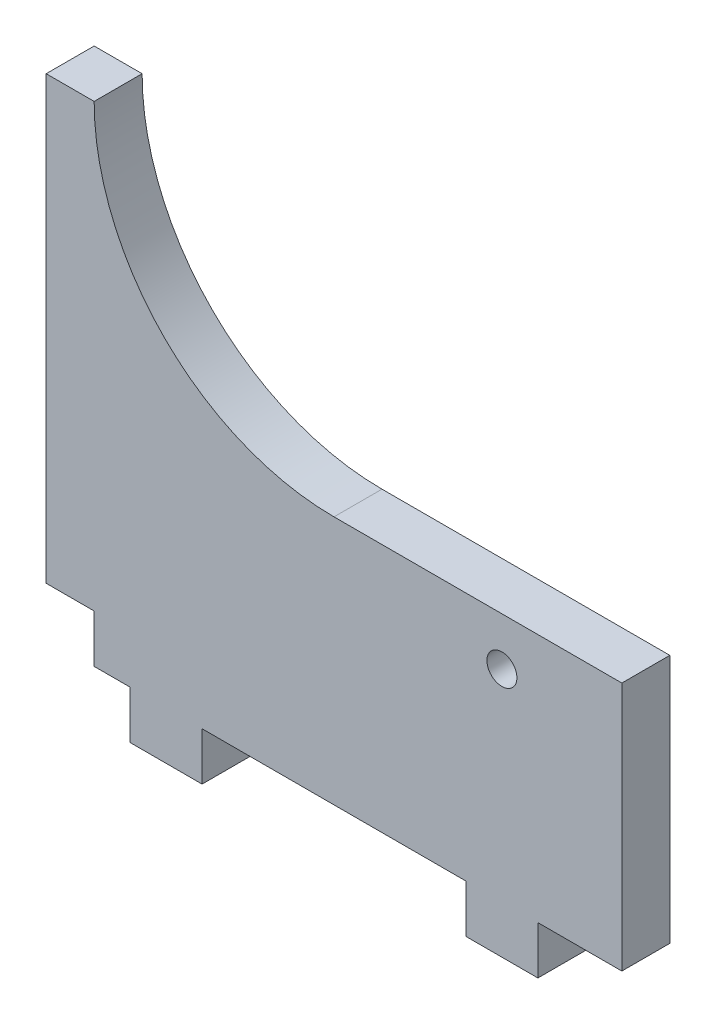
ISO-10303-21;
HEADER;
FILE_DESCRIPTION(('STEP AP214'),'2;1');
FILE_NAME('part.step','',(''),(''),'','','');
FILE_SCHEMA(('AUTOMOTIVE_DESIGN { 1 0 10303 214 1 1 1 1 }'));
ENDSEC;
DATA;
#1=APPLICATION_CONTEXT('core data for automotive mechanical design processes');
#2=APPLICATION_PROTOCOL_DEFINITION('international standard','automotive_design',2000,#1);
#3=PRODUCT_CONTEXT('',#1,'mechanical');
#4=PRODUCT('Part','Part','',(#3));
#5=PRODUCT_RELATED_PRODUCT_CATEGORY('part','',(#4));
#6=PRODUCT_DEFINITION_FORMATION('','',#4);
#7=PRODUCT_DEFINITION_CONTEXT('part definition',#1,'design');
#8=PRODUCT_DEFINITION('design','',#6,#7);
#9=PRODUCT_DEFINITION_SHAPE('','',#8);
#10=(LENGTH_UNIT() NAMED_UNIT(*) SI_UNIT(.MILLI.,.METRE.));
#11=(NAMED_UNIT(*) PLANE_ANGLE_UNIT() SI_UNIT($,.RADIAN.));
#12=(NAMED_UNIT(*) SI_UNIT($,.STERADIAN.) SOLID_ANGLE_UNIT());
#13=UNCERTAINTY_MEASURE_WITH_UNIT(LENGTH_MEASURE(1.E-05),#10,'distance_accuracy_value','');
#14=(GEOMETRIC_REPRESENTATION_CONTEXT(3) GLOBAL_UNCERTAINTY_ASSIGNED_CONTEXT((#13)) GLOBAL_UNIT_ASSIGNED_CONTEXT((#10,
#11,#12)) REPRESENTATION_CONTEXT('',''));
#15=CARTESIAN_POINT('',(0.,0.,0.));
#16=DIRECTION('',(0.,0.,1.));
#17=DIRECTION('',(1.,0.,0.));
#18=AXIS2_PLACEMENT_3D('',#15,#16,#17);
#19=CARTESIAN_POINT('',(0.,142.24,12.7));
#20=DIRECTION('',(0.,0.,-1.));
#21=DIRECTION('',(-1.,0.,0.));
#22=AXIS2_PLACEMENT_3D('',#19,#20,#21);
#23=CYLINDRICAL_SURFACE('',#22,63.5);
#24=DIRECTION('',(0.,0.,1.));
#25=VECTOR('',#24,1.);
#26=CARTESIAN_POINT('',(0.,78.74,0.));
#27=LINE('',#26,#25);
#28=CARTESIAN_POINT('',(0.,78.74,0.));
#29=VERTEX_POINT('',#28);
#30=CARTESIAN_POINT('',(0.,78.74,12.7));
#31=VERTEX_POINT('',#30);
#32=EDGE_CURVE('E144',#29,#31,#27,.T.);
#33=ORIENTED_EDGE('',*,*,#32,.F.);
#34=CARTESIAN_POINT('',(0.,142.24,0.));
#35=DIRECTION('',(0.,0.,-1.));
#36=DIRECTION('',(1.,0.,0.));
#37=AXIS2_PLACEMENT_3D('',#34,#35,#36);
#38=CIRCLE('',#37,63.5);
#39=CARTESIAN_POINT('',(-63.5,142.24,0.));
#40=VERTEX_POINT('',#39);
#41=EDGE_CURVE('E155',#29,#40,#38,.T.);
#42=ORIENTED_EDGE('',*,*,#41,.T.);
#43=DIRECTION('',(0.,0.,-1.));
#44=VECTOR('',#43,1.);
#45=CARTESIAN_POINT('',(-63.5,142.24,12.7));
#46=LINE('',#45,#44);
#47=CARTESIAN_POINT('',(-63.5,142.24,12.7));
#48=VERTEX_POINT('',#47);
#49=EDGE_CURVE('E174',#48,#40,#46,.T.);
#50=ORIENTED_EDGE('',*,*,#49,.F.);
#51=CARTESIAN_POINT('',(0.,142.24,12.7));
#52=DIRECTION('',(0.,0.,-1.));
#53=DIRECTION('',(1.,0.,0.));
#54=AXIS2_PLACEMENT_3D('',#51,#52,#53);
#55=CIRCLE('',#54,63.5);
#56=EDGE_CURVE('E157',#31,#48,#55,.T.);
#57=ORIENTED_EDGE('',*,*,#56,.F.);
#58=EDGE_LOOP('',(#33,#42,#50,#57));
#59=FACE_BOUND('',#58,.T.);
#60=ADVANCED_FACE('F31',(#59),#23,.F.);
#61=CARTESIAN_POINT('',(-76.2,12.7,12.7));
#62=DIRECTION('',(1.,0.,0.));
#63=DIRECTION('',(0.,1.,0.));
#64=AXIS2_PLACEMENT_3D('',#61,#62,#63);
#65=PLANE('',#64);
#66=DIRECTION('',(0.,-1.,0.));
#67=VECTOR('',#66,1.);
#68=CARTESIAN_POINT('',(-76.2,12.7,0.));
#69=LINE('',#68,#67);
#70=CARTESIAN_POINT('',(-76.2,142.24,0.));
#71=VERTEX_POINT('',#70);
#72=CARTESIAN_POINT('',(-76.2,25.4,0.));
#73=VERTEX_POINT('',#72);
#74=EDGE_CURVE('E248',#71,#73,#69,.T.);
#75=ORIENTED_EDGE('',*,*,#74,.T.);
#76=DIRECTION('',(0.,0.,1.));
#77=VECTOR('',#76,1.);
#78=CARTESIAN_POINT('',(-76.2,25.4,0.));
#79=LINE('',#78,#77);
#80=CARTESIAN_POINT('',(-76.2,25.4,12.7));
#81=VERTEX_POINT('',#80);
#82=EDGE_CURVE('E427',#73,#81,#79,.T.);
#83=ORIENTED_EDGE('',*,*,#82,.T.);
#84=DIRECTION('',(0.,-1.,0.));
#85=VECTOR('',#84,1.);
#86=CARTESIAN_POINT('',(-76.2,12.7,12.7));
#87=LINE('',#86,#85);
#88=CARTESIAN_POINT('',(-76.2,142.24,12.7));
#89=VERTEX_POINT('',#88);
#90=EDGE_CURVE('E165',#89,#81,#87,.T.);
#91=ORIENTED_EDGE('',*,*,#90,.F.);
#92=DIRECTION('',(0.,0.,-1.));
#93=VECTOR('',#92,1.);
#94=CARTESIAN_POINT('',(-76.2,142.24,12.7));
#95=LINE('',#94,#93);
#96=EDGE_CURVE('E171',#89,#71,#95,.T.);
#97=ORIENTED_EDGE('',*,*,#96,.T.);
#98=EDGE_LOOP('',(#75,#83,#91,#97));
#99=FACE_BOUND('',#98,.T.);
#100=ADVANCED_FACE('F33',(#99),#65,.F.);
#101=CARTESIAN_POINT('',(-76.2,12.7,12.7));
#102=DIRECTION('',(0.,1.,0.));
#103=DIRECTION('',(0.,0.,1.));
#104=AXIS2_PLACEMENT_3D('',#101,#102,#103);
#105=PLANE('',#104);
#106=DIRECTION('',(1.,0.,0.));
#107=VECTOR('',#106,1.);
#108=CARTESIAN_POINT('',(-76.2,12.7,12.7));
#109=LINE('',#108,#107);
#110=CARTESIAN_POINT('',(-63.5,12.7,12.7));
#111=VERTEX_POINT('',#110);
#112=CARTESIAN_POINT('',(-53.975,12.7,12.7));
#113=VERTEX_POINT('',#112);
#114=EDGE_CURVE('E260',#111,#113,#109,.T.);
#115=ORIENTED_EDGE('',*,*,#114,.F.);
#116=DIRECTION('',(0.,0.,1.));
#117=VECTOR('',#116,1.);
#118=CARTESIAN_POINT('',(-63.5,12.7,0.));
#119=LINE('',#118,#117);
#120=CARTESIAN_POINT('',(-63.5,12.7,0.));
#121=VERTEX_POINT('',#120);
#122=EDGE_CURVE('E256',#121,#111,#119,.T.);
#123=ORIENTED_EDGE('',*,*,#122,.F.);
#124=DIRECTION('',(1.,0.,0.));
#125=VECTOR('',#124,1.);
#126=CARTESIAN_POINT('',(-76.2,12.7,0.));
#127=LINE('',#126,#125);
#128=CARTESIAN_POINT('',(-53.975,12.7,0.));
#129=VERTEX_POINT('',#128);
#130=EDGE_CURVE('E217',#121,#129,#127,.T.);
#131=ORIENTED_EDGE('',*,*,#130,.T.);
#132=DIRECTION('',(0.,0.,-1.));
#133=VECTOR('',#132,1.);
#134=CARTESIAN_POINT('',(-53.975,12.7,12.7));
#135=LINE('',#134,#133);
#136=EDGE_CURVE('E11',#113,#129,#135,.T.);
#137=ORIENTED_EDGE('',*,*,#136,.F.);
#138=EDGE_LOOP('',(#115,#123,#131,#137));
#139=FACE_BOUND('',#138,.T.);
#140=ADVANCED_FACE('F255',(#139),#105,.F.);
#141=CARTESIAN_POINT('',(-53.975,0.,12.7));
#142=DIRECTION('',(1.,0.,0.));
#143=DIRECTION('',(0.,0.,-1.));
#144=AXIS2_PLACEMENT_3D('',#141,#142,#143);
#145=PLANE('',#144);
#146=DIRECTION('',(0.,-1.,0.));
#147=VECTOR('',#146,1.);
#148=CARTESIAN_POINT('',(-53.975,0.,0.));
#149=LINE('',#148,#147);
#150=CARTESIAN_POINT('',(-53.975,0.,0.));
#151=VERTEX_POINT('',#150);
#152=EDGE_CURVE('E211',#129,#151,#149,.T.);
#153=ORIENTED_EDGE('',*,*,#152,.T.);
#154=DIRECTION('',(0.,0.,-1.));
#155=VECTOR('',#154,1.);
#156=CARTESIAN_POINT('',(-53.975,0.,12.7));
#157=LINE('',#156,#155);
#158=CARTESIAN_POINT('',(-53.975,0.,12.7));
#159=VERTEX_POINT('',#158);
#160=EDGE_CURVE('E39',#159,#151,#157,.T.);
#161=ORIENTED_EDGE('',*,*,#160,.F.);
#162=DIRECTION('',(0.,-1.,0.));
#163=VECTOR('',#162,1.);
#164=CARTESIAN_POINT('',(-53.975,0.,12.7));
#165=LINE('',#164,#163);
#166=EDGE_CURVE('E259',#113,#159,#165,.T.);
#167=ORIENTED_EDGE('',*,*,#166,.F.);
#168=ORIENTED_EDGE('',*,*,#136,.T.);
#169=EDGE_LOOP('',(#153,#161,#167,#168));
#170=FACE_BOUND('',#169,.T.);
#171=ADVANCED_FACE('F258',(#170),#145,.F.);
#172=CARTESIAN_POINT('',(-53.975,0.,12.7));
#173=DIRECTION('',(0.,1.,0.));
#174=DIRECTION('',(0.,0.,1.));
#175=AXIS2_PLACEMENT_3D('',#172,#173,#174);
#176=PLANE('',#175);
#177=DIRECTION('',(1.,0.,0.));
#178=VECTOR('',#177,1.);
#179=CARTESIAN_POINT('',(-53.975,0.,0.));
#180=LINE('',#179,#178);
#181=CARTESIAN_POINT('',(-34.925,0.,0.));
#182=VERTEX_POINT('',#181);
#183=EDGE_CURVE('E204',#151,#182,#180,.T.);
#184=ORIENTED_EDGE('',*,*,#183,.T.);
#185=DIRECTION('',(0.,0.,-1.));
#186=VECTOR('',#185,1.);
#187=CARTESIAN_POINT('',(-34.925,0.,12.7));
#188=LINE('',#187,#186);
#189=CARTESIAN_POINT('',(-34.925,0.,12.7));
#190=VERTEX_POINT('',#189);
#191=EDGE_CURVE('E195',#190,#182,#188,.T.);
#192=ORIENTED_EDGE('',*,*,#191,.F.);
#193=DIRECTION('',(1.,0.,0.));
#194=VECTOR('',#193,1.);
#195=CARTESIAN_POINT('',(-53.975,0.,12.7));
#196=LINE('',#195,#194);
#197=EDGE_CURVE('E205',#159,#190,#196,.T.);
#198=ORIENTED_EDGE('',*,*,#197,.F.);
#199=ORIENTED_EDGE('',*,*,#160,.T.);
#200=EDGE_LOOP('',(#184,#192,#198,#199));
#201=FACE_BOUND('',#200,.T.);
#202=ADVANCED_FACE('F202',(#201),#176,.F.);
#203=CARTESIAN_POINT('',(-34.925,0.,12.7));
#204=DIRECTION('',(-1.,0.,0.));
#205=DIRECTION('',(0.,0.,1.));
#206=AXIS2_PLACEMENT_3D('',#203,#204,#205);
#207=PLANE('',#206);
#208=DIRECTION('',(0.,1.,0.));
#209=VECTOR('',#208,1.);
#210=CARTESIAN_POINT('',(-34.925,0.,0.));
#211=LINE('',#210,#209);
#212=CARTESIAN_POINT('',(-34.925,12.7,0.));
#213=VERTEX_POINT('',#212);
#214=EDGE_CURVE('E213',#182,#213,#211,.T.);
#215=ORIENTED_EDGE('',*,*,#214,.T.);
#216=DIRECTION('',(0.,0.,-1.));
#217=VECTOR('',#216,1.);
#218=CARTESIAN_POINT('',(-34.925,12.7,12.7));
#219=LINE('',#218,#217);
#220=CARTESIAN_POINT('',(-34.925,12.7,12.7));
#221=VERTEX_POINT('',#220);
#222=EDGE_CURVE('E192',#221,#213,#219,.T.);
#223=ORIENTED_EDGE('',*,*,#222,.F.);
#224=DIRECTION('',(0.,1.,0.));
#225=VECTOR('',#224,1.);
#226=CARTESIAN_POINT('',(-34.925,0.,12.7));
#227=LINE('',#226,#225);
#228=EDGE_CURVE('E262',#190,#221,#227,.T.);
#229=ORIENTED_EDGE('',*,*,#228,.F.);
#230=ORIENTED_EDGE('',*,*,#191,.T.);
#231=EDGE_LOOP('',(#215,#223,#229,#230));
#232=FACE_BOUND('',#231,.T.);
#233=ADVANCED_FACE('F295',(#232),#207,.F.);
#234=CARTESIAN_POINT('',(-34.925,12.7,12.7));
#235=DIRECTION('',(0.,1.,0.));
#236=DIRECTION('',(0.,0.,1.));
#237=AXIS2_PLACEMENT_3D('',#234,#235,#236);
#238=PLANE('',#237);
#239=DIRECTION('',(1.,0.,0.));
#240=VECTOR('',#239,1.);
#241=CARTESIAN_POINT('',(-34.925,12.7,0.));
#242=LINE('',#241,#240);
#243=CARTESIAN_POINT('',(34.925,12.7,0.));
#244=VERTEX_POINT('',#243);
#245=EDGE_CURVE('E215',#213,#244,#242,.T.);
#246=ORIENTED_EDGE('',*,*,#245,.T.);
#247=DIRECTION('',(0.,0.,-1.));
#248=VECTOR('',#247,1.);
#249=CARTESIAN_POINT('',(34.925,12.7,12.7));
#250=LINE('',#249,#248);
#251=CARTESIAN_POINT('',(34.925,12.7,12.7));
#252=VERTEX_POINT('',#251);
#253=EDGE_CURVE('E189',#252,#244,#250,.T.);
#254=ORIENTED_EDGE('',*,*,#253,.F.);
#255=DIRECTION('',(1.,0.,0.));
#256=VECTOR('',#255,1.);
#257=CARTESIAN_POINT('',(-34.925,12.7,12.7));
#258=LINE('',#257,#256);
#259=EDGE_CURVE('E268',#221,#252,#258,.T.);
#260=ORIENTED_EDGE('',*,*,#259,.F.);
#261=ORIENTED_EDGE('',*,*,#222,.T.);
#262=EDGE_LOOP('',(#246,#254,#260,#261));
#263=FACE_BOUND('',#262,.T.);
#264=ADVANCED_FACE('F291',(#263),#238,.F.);
#265=CARTESIAN_POINT('',(34.925,0.,12.7));
#266=DIRECTION('',(1.,0.,0.));
#267=DIRECTION('',(0.,0.,-1.));
#268=AXIS2_PLACEMENT_3D('',#265,#266,#267);
#269=PLANE('',#268);
#270=DIRECTION('',(0.,-1.,0.));
#271=VECTOR('',#270,1.);
#272=CARTESIAN_POINT('',(34.925,0.,0.));
#273=LINE('',#272,#271);
#274=CARTESIAN_POINT('',(34.925,0.,0.));
#275=VERTEX_POINT('',#274);
#276=EDGE_CURVE('E222',#244,#275,#273,.T.);
#277=ORIENTED_EDGE('',*,*,#276,.T.);
#278=DIRECTION('',(0.,0.,-1.));
#279=VECTOR('',#278,1.);
#280=CARTESIAN_POINT('',(34.925,0.,12.7));
#281=LINE('',#280,#279);
#282=CARTESIAN_POINT('',(34.925,0.,12.7));
#283=VERTEX_POINT('',#282);
#284=EDGE_CURVE('E186',#283,#275,#281,.T.);
#285=ORIENTED_EDGE('',*,*,#284,.F.);
#286=DIRECTION('',(0.,-1.,0.));
#287=VECTOR('',#286,1.);
#288=CARTESIAN_POINT('',(34.925,0.,12.7));
#289=LINE('',#288,#287);
#290=EDGE_CURVE('E270',#252,#283,#289,.T.);
#291=ORIENTED_EDGE('',*,*,#290,.F.);
#292=ORIENTED_EDGE('',*,*,#253,.T.);
#293=EDGE_LOOP('',(#277,#285,#291,#292));
#294=FACE_BOUND('',#293,.T.);
#295=ADVANCED_FACE('F287',(#294),#269,.F.);
#296=CARTESIAN_POINT('',(34.925,0.,12.7));
#297=DIRECTION('',(0.,1.,0.));
#298=DIRECTION('',(0.,0.,1.));
#299=AXIS2_PLACEMENT_3D('',#296,#297,#298);
#300=PLANE('',#299);
#301=DIRECTION('',(1.,0.,0.));
#302=VECTOR('',#301,1.);
#303=CARTESIAN_POINT('',(34.925,0.,0.));
#304=LINE('',#303,#302);
#305=CARTESIAN_POINT('',(53.975,0.,0.));
#306=VERTEX_POINT('',#305);
#307=EDGE_CURVE('E224',#275,#306,#304,.T.);
#308=ORIENTED_EDGE('',*,*,#307,.T.);
#309=DIRECTION('',(0.,0.,-1.));
#310=VECTOR('',#309,1.);
#311=CARTESIAN_POINT('',(53.975,0.,12.7));
#312=LINE('',#311,#310);
#313=CARTESIAN_POINT('',(53.975,0.,12.7));
#314=VERTEX_POINT('',#313);
#315=EDGE_CURVE('E183',#314,#306,#312,.T.);
#316=ORIENTED_EDGE('',*,*,#315,.F.);
#317=DIRECTION('',(1.,0.,0.));
#318=VECTOR('',#317,1.);
#319=CARTESIAN_POINT('',(34.925,0.,12.7));
#320=LINE('',#319,#318);
#321=EDGE_CURVE('E272',#283,#314,#320,.T.);
#322=ORIENTED_EDGE('',*,*,#321,.F.);
#323=ORIENTED_EDGE('',*,*,#284,.T.);
#324=EDGE_LOOP('',(#308,#316,#322,#323));
#325=FACE_BOUND('',#324,.T.);
#326=ADVANCED_FACE('F283',(#325),#300,.F.);
#327=CARTESIAN_POINT('',(53.975,0.,12.7));
#328=DIRECTION('',(-1.,0.,0.));
#329=DIRECTION('',(0.,0.,1.));
#330=AXIS2_PLACEMENT_3D('',#327,#328,#329);
#331=PLANE('',#330);
#332=DIRECTION('',(0.,1.,0.));
#333=VECTOR('',#332,1.);
#334=CARTESIAN_POINT('',(53.975,0.,0.));
#335=LINE('',#334,#333);
#336=CARTESIAN_POINT('',(53.975,12.7,0.));
#337=VERTEX_POINT('',#336);
#338=EDGE_CURVE('E226',#306,#337,#335,.T.);
#339=ORIENTED_EDGE('',*,*,#338,.T.);
#340=DIRECTION('',(0.,0.,-1.));
#341=VECTOR('',#340,1.);
#342=CARTESIAN_POINT('',(53.975,12.7,12.7));
#343=LINE('',#342,#341);
#344=CARTESIAN_POINT('',(53.975,12.7,12.7));
#345=VERTEX_POINT('',#344);
#346=EDGE_CURVE('E180',#345,#337,#343,.T.);
#347=ORIENTED_EDGE('',*,*,#346,.F.);
#348=DIRECTION('',(0.,1.,0.));
#349=VECTOR('',#348,1.);
#350=CARTESIAN_POINT('',(53.975,0.,12.7));
#351=LINE('',#350,#349);
#352=EDGE_CURVE('E243',#314,#345,#351,.T.);
#353=ORIENTED_EDGE('',*,*,#352,.F.);
#354=ORIENTED_EDGE('',*,*,#315,.T.);
#355=EDGE_LOOP('',(#339,#347,#353,#354));
#356=FACE_BOUND('',#355,.T.);
#357=ADVANCED_FACE('F279',(#356),#331,.F.);
#358=CARTESIAN_POINT('',(53.975,12.7,12.7));
#359=DIRECTION('',(0.,1.,0.));
#360=DIRECTION('',(0.,0.,1.));
#361=AXIS2_PLACEMENT_3D('',#358,#359,#360);
#362=PLANE('',#361);
#363=DIRECTION('',(1.,0.,0.));
#364=VECTOR('',#363,1.);
#365=CARTESIAN_POINT('',(53.975,12.7,0.));
#366=LINE('',#365,#364);
#367=CARTESIAN_POINT('',(76.2,12.7,0.));
#368=VERTEX_POINT('',#367);
#369=EDGE_CURVE('E167',#337,#368,#366,.T.);
#370=ORIENTED_EDGE('',*,*,#369,.T.);
#371=DIRECTION('',(0.,0.,-1.));
#372=VECTOR('',#371,1.);
#373=CARTESIAN_POINT('',(76.2,12.7,12.7));
#374=LINE('',#373,#372);
#375=CARTESIAN_POINT('',(76.2,12.7,12.7));
#376=VERTEX_POINT('',#375);
#377=EDGE_CURVE('E177',#376,#368,#374,.T.);
#378=ORIENTED_EDGE('',*,*,#377,.F.);
#379=DIRECTION('',(1.,0.,0.));
#380=VECTOR('',#379,1.);
#381=CARTESIAN_POINT('',(53.975,12.7,12.7));
#382=LINE('',#381,#380);
#383=EDGE_CURVE('E240',#345,#376,#382,.T.);
#384=ORIENTED_EDGE('',*,*,#383,.F.);
#385=ORIENTED_EDGE('',*,*,#346,.T.);
#386=EDGE_LOOP('',(#370,#378,#384,#385));
#387=FACE_BOUND('',#386,.T.);
#388=ADVANCED_FACE('F230',(#387),#362,.F.);
#389=CARTESIAN_POINT('',(76.2,12.7,12.7));
#390=DIRECTION('',(-1.,0.,0.));
#391=DIRECTION('',(0.,-1.,0.));
#392=AXIS2_PLACEMENT_3D('',#389,#390,#391);
#393=PLANE('',#392);
#394=DIRECTION('',(0.,1.,0.));
#395=VECTOR('',#394,1.);
#396=CARTESIAN_POINT('',(76.2,12.7,0.));
#397=LINE('',#396,#395);
#398=CARTESIAN_POINT('',(76.2,78.74,0.));
#399=VERTEX_POINT('',#398);
#400=EDGE_CURVE('E163',#368,#399,#397,.T.);
#401=ORIENTED_EDGE('',*,*,#400,.T.);
#402=DIRECTION('',(0.,0.,1.));
#403=VECTOR('',#402,1.);
#404=CARTESIAN_POINT('',(76.2,78.74,12.7));
#405=LINE('',#404,#403);
#406=CARTESIAN_POINT('',(76.2,78.74,12.7));
#407=VERTEX_POINT('',#406);
#408=EDGE_CURVE('E46',#399,#407,#405,.T.);
#409=ORIENTED_EDGE('',*,*,#408,.T.);
#410=DIRECTION('',(0.,1.,0.));
#411=VECTOR('',#410,1.);
#412=CARTESIAN_POINT('',(76.2,12.7,12.7));
#413=LINE('',#412,#411);
#414=EDGE_CURVE('E238',#376,#407,#413,.T.);
#415=ORIENTED_EDGE('',*,*,#414,.F.);
#416=ORIENTED_EDGE('',*,*,#377,.T.);
#417=EDGE_LOOP('',(#401,#409,#415,#416));
#418=FACE_BOUND('',#417,.T.);
#419=ADVANCED_FACE('F236',(#418),#393,.F.);
#420=CARTESIAN_POINT('',(-76.2,142.24,12.7));
#421=DIRECTION('',(0.,-1.,0.));
#422=DIRECTION('',(0.,0.,-1.));
#423=AXIS2_PLACEMENT_3D('',#420,#421,#422);
#424=PLANE('',#423);
#425=DIRECTION('',(-1.,0.,0.));
#426=VECTOR('',#425,1.);
#427=CARTESIAN_POINT('',(-76.2,142.24,0.));
#428=LINE('',#427,#426);
#429=EDGE_CURVE('E162',#40,#71,#428,.T.);
#430=ORIENTED_EDGE('',*,*,#429,.T.);
#431=ORIENTED_EDGE('',*,*,#96,.F.);
#432=DIRECTION('',(-1.,0.,0.));
#433=VECTOR('',#432,1.);
#434=CARTESIAN_POINT('',(-76.2,142.24,12.7));
#435=LINE('',#434,#433);
#436=EDGE_CURVE('E175',#48,#89,#435,.T.);
#437=ORIENTED_EDGE('',*,*,#436,.F.);
#438=ORIENTED_EDGE('',*,*,#49,.T.);
#439=EDGE_LOOP('',(#430,#431,#437,#438));
#440=FACE_BOUND('',#439,.T.);
#441=ADVANCED_FACE('F314',(#440),#424,.F.);
#442=CARTESIAN_POINT('',(0.,142.24,12.7));
#443=DIRECTION('',(0.,0.,1.));
#444=DIRECTION('',(1.,0.,0.));
#445=AXIS2_PLACEMENT_3D('',#442,#443,#444);
#446=PLANE('',#445);
#447=DIRECTION('',(1.,0.,0.));
#448=VECTOR('',#447,1.);
#449=CARTESIAN_POINT('',(0.,78.74,12.7));
#450=LINE('',#449,#448);
#451=EDGE_CURVE('E150',#31,#407,#450,.T.);
#452=ORIENTED_EDGE('',*,*,#451,.F.);
#453=ORIENTED_EDGE('',*,*,#56,.T.);
#454=ORIENTED_EDGE('',*,*,#436,.T.);
#455=ORIENTED_EDGE('',*,*,#90,.T.);
#456=DIRECTION('',(-1.,0.,0.));
#457=VECTOR('',#456,1.);
#458=CARTESIAN_POINT('',(-76.2,25.4,12.7));
#459=LINE('',#458,#457);
#460=CARTESIAN_POINT('',(-63.5,25.4,12.7));
#461=VERTEX_POINT('',#460);
#462=EDGE_CURVE('E417',#461,#81,#459,.T.);
#463=ORIENTED_EDGE('',*,*,#462,.F.);
#464=DIRECTION('',(0.,1.,0.));
#465=VECTOR('',#464,1.);
#466=CARTESIAN_POINT('',(-63.5,12.7,12.7));
#467=LINE('',#466,#465);
#468=EDGE_CURVE('E414',#111,#461,#467,.T.);
#469=ORIENTED_EDGE('',*,*,#468,.F.);
#470=ORIENTED_EDGE('',*,*,#114,.T.);
#471=ORIENTED_EDGE('',*,*,#166,.T.);
#472=ORIENTED_EDGE('',*,*,#197,.T.);
#473=ORIENTED_EDGE('',*,*,#228,.T.);
#474=ORIENTED_EDGE('',*,*,#259,.T.);
#475=ORIENTED_EDGE('',*,*,#290,.T.);
#476=ORIENTED_EDGE('',*,*,#321,.T.);
#477=ORIENTED_EDGE('',*,*,#352,.T.);
#478=ORIENTED_EDGE('',*,*,#383,.T.);
#479=ORIENTED_EDGE('',*,*,#414,.T.);
#480=EDGE_LOOP('',(#452,#453,#454,#455,#463,#469,#470,#471,#472,#473,#474,#475,#476,#477,#478,#479));
#481=FACE_BOUND('',#480,.T.);
#482=CARTESIAN_POINT('',(44.45,66.04,12.7));
#483=DIRECTION('',(0.,0.,1.));
#484=DIRECTION('',(1.,0.,0.));
#485=AXIS2_PLACEMENT_3D('',#482,#483,#484);
#486=CIRCLE('',#485,3.96874999999998);
#487=CARTESIAN_POINT('',(48.41875,66.04,12.7));
#488=VERTEX_POINT('',#487);
#489=EDGE_CURVE('E429',#488,#488,#486,.T.);
#490=ORIENTED_EDGE('',*,*,#489,.F.);
#491=EDGE_LOOP('',(#490));
#492=FACE_BOUND('',#491,.T.);
#493=ADVANCED_FACE('F274',(#481,#492),#446,.T.);
#494=CARTESIAN_POINT('',(0.,142.24,0.));
#495=DIRECTION('',(0.,0.,1.));
#496=DIRECTION('',(1.,0.,0.));
#497=AXIS2_PLACEMENT_3D('',#494,#495,#496);
#498=PLANE('',#497);
#499=CARTESIAN_POINT('',(44.45,66.04,0.));
#500=DIRECTION('',(0.,0.,1.));
#501=DIRECTION('',(1.,0.,0.));
#502=AXIS2_PLACEMENT_3D('',#499,#500,#501);
#503=CIRCLE('',#502,3.96874999999998);
#504=CARTESIAN_POINT('',(48.41875,66.04,0.));
#505=VERTEX_POINT('',#504);
#506=EDGE_CURVE('E250',#505,#505,#503,.T.);
#507=ORIENTED_EDGE('',*,*,#506,.T.);
#508=EDGE_LOOP('',(#507));
#509=FACE_BOUND('',#508,.T.);
#510=ORIENTED_EDGE('',*,*,#41,.F.);
#511=DIRECTION('',(1.,0.,0.));
#512=VECTOR('',#511,1.);
#513=CARTESIAN_POINT('',(0.,78.74,0.));
#514=LINE('',#513,#512);
#515=EDGE_CURVE('E141',#29,#399,#514,.T.);
#516=ORIENTED_EDGE('',*,*,#515,.T.);
#517=ORIENTED_EDGE('',*,*,#400,.F.);
#518=ORIENTED_EDGE('',*,*,#369,.F.);
#519=ORIENTED_EDGE('',*,*,#338,.F.);
#520=ORIENTED_EDGE('',*,*,#307,.F.);
#521=ORIENTED_EDGE('',*,*,#276,.F.);
#522=ORIENTED_EDGE('',*,*,#245,.F.);
#523=ORIENTED_EDGE('',*,*,#214,.F.);
#524=ORIENTED_EDGE('',*,*,#183,.F.);
#525=ORIENTED_EDGE('',*,*,#152,.F.);
#526=ORIENTED_EDGE('',*,*,#130,.F.);
#527=DIRECTION('',(0.,1.,0.));
#528=VECTOR('',#527,1.);
#529=CARTESIAN_POINT('',(-63.5,12.7,0.));
#530=LINE('',#529,#528);
#531=CARTESIAN_POINT('',(-63.5,25.4,0.));
#532=VERTEX_POINT('',#531);
#533=EDGE_CURVE('E422',#121,#532,#530,.T.);
#534=ORIENTED_EDGE('',*,*,#533,.T.);
#535=DIRECTION('',(-1.,0.,0.));
#536=VECTOR('',#535,1.);
#537=CARTESIAN_POINT('',(-76.2,25.4,0.));
#538=LINE('',#537,#536);
#539=EDGE_CURVE('E54',#532,#73,#538,.T.);
#540=ORIENTED_EDGE('',*,*,#539,.T.);
#541=ORIENTED_EDGE('',*,*,#74,.F.);
#542=ORIENTED_EDGE('',*,*,#429,.F.);
#543=EDGE_LOOP('',(#510,#516,#517,#518,#519,#520,#521,#522,#523,#524,#525,#526,#534,#540,#541,#542));
#544=FACE_BOUND('',#543,.T.);
#545=ADVANCED_FACE('F160',(#509,#544),#498,.F.);
#546=CARTESIAN_POINT('',(44.45,66.04,0.));
#547=DIRECTION('',(0.,0.,1.));
#548=DIRECTION('',(1.,0.,0.));
#549=AXIS2_PLACEMENT_3D('',#546,#547,#548);
#550=CYLINDRICAL_SURFACE('',#549,3.96874999999998);
#551=ORIENTED_EDGE('',*,*,#506,.F.);
#552=EDGE_LOOP('',(#551));
#553=FACE_BOUND('',#552,.T.);
#554=ORIENTED_EDGE('',*,*,#489,.T.);
#555=EDGE_LOOP('',(#554));
#556=FACE_BOUND('',#555,.T.);
#557=ADVANCED_FACE('F368',(#553,#556),#550,.F.);
#558=CARTESIAN_POINT('',(-76.2,25.4,0.));
#559=DIRECTION('',(0.,1.,0.));
#560=DIRECTION('',(0.,0.,1.));
#561=AXIS2_PLACEMENT_3D('',#558,#559,#560);
#562=PLANE('',#561);
#563=ORIENTED_EDGE('',*,*,#462,.T.);
#564=ORIENTED_EDGE('',*,*,#82,.F.);
#565=ORIENTED_EDGE('',*,*,#539,.F.);
#566=DIRECTION('',(0.,0.,1.));
#567=VECTOR('',#566,1.);
#568=CARTESIAN_POINT('',(-63.5,25.4,0.));
#569=LINE('',#568,#567);
#570=EDGE_CURVE('E416',#532,#461,#569,.T.);
#571=ORIENTED_EDGE('',*,*,#570,.T.);
#572=EDGE_LOOP('',(#563,#564,#565,#571));
#573=FACE_BOUND('',#572,.T.);
#574=ADVANCED_FACE('F377',(#573),#562,.F.);
#575=CARTESIAN_POINT('',(-63.5,12.7,0.));
#576=DIRECTION('',(1.,0.,0.));
#577=DIRECTION('',(0.,0.,-1.));
#578=AXIS2_PLACEMENT_3D('',#575,#576,#577);
#579=PLANE('',#578);
#580=ORIENTED_EDGE('',*,*,#468,.T.);
#581=ORIENTED_EDGE('',*,*,#570,.F.);
#582=ORIENTED_EDGE('',*,*,#533,.F.);
#583=ORIENTED_EDGE('',*,*,#122,.T.);
#584=EDGE_LOOP('',(#580,#581,#582,#583));
#585=FACE_BOUND('',#584,.T.);
#586=ADVANCED_FACE('F385',(#585),#579,.F.);
#587=CARTESIAN_POINT('',(0.,78.74,0.));
#588=DIRECTION('',(0.,-1.,0.));
#589=DIRECTION('',(0.,0.,-1.));
#590=AXIS2_PLACEMENT_3D('',#587,#588,#589);
#591=PLANE('',#590);
#592=ORIENTED_EDGE('',*,*,#515,.F.);
#593=ORIENTED_EDGE('',*,*,#32,.T.);
#594=ORIENTED_EDGE('',*,*,#451,.T.);
#595=ORIENTED_EDGE('',*,*,#408,.F.);
#596=EDGE_LOOP('',(#592,#593,#594,#595));
#597=FACE_BOUND('',#596,.T.);
#598=ADVANCED_FACE('F143',(#597),#591,.F.);
#599=CLOSED_SHELL('',(#60,#100,#140,#171,#202,#233,#264,#295,#326,#357,#388,#419,#441,#493,#545,
#557,#574,#586,#598));
#600=MANIFOLD_SOLID_BREP('B2',#599);
#601=ADVANCED_BREP_SHAPE_REPRESENTATION('',(#18,#600),#14);
#602=SHAPE_DEFINITION_REPRESENTATION(#9,#601);
ENDSEC;
END-ISO-10303-21;
